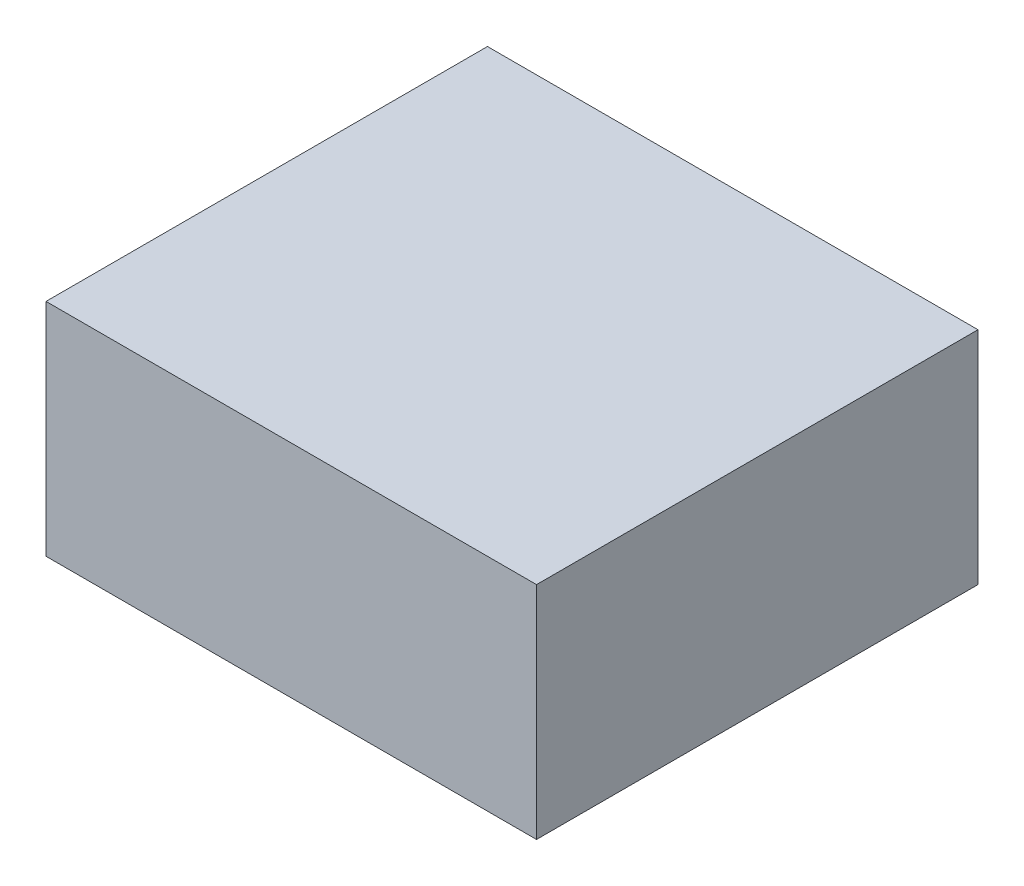
ISO-10303-21;
HEADER;
FILE_DESCRIPTION(('STEP AP214'),'2;1');
FILE_NAME('part.step','',(''),(''),'','','');
FILE_SCHEMA(('AUTOMOTIVE_DESIGN { 1 0 10303 214 1 1 1 1 }'));
ENDSEC;
DATA;
#1=APPLICATION_CONTEXT('core data for automotive mechanical design processes');
#2=APPLICATION_PROTOCOL_DEFINITION('international standard','automotive_design',2000,#1);
#3=PRODUCT_CONTEXT('',#1,'mechanical');
#4=PRODUCT('Part','Part','',(#3));
#5=PRODUCT_RELATED_PRODUCT_CATEGORY('part','',(#4));
#6=PRODUCT_DEFINITION_FORMATION('','',#4);
#7=PRODUCT_DEFINITION_CONTEXT('part definition',#1,'design');
#8=PRODUCT_DEFINITION('design','',#6,#7);
#9=PRODUCT_DEFINITION_SHAPE('','',#8);
#10=(LENGTH_UNIT() NAMED_UNIT(*) SI_UNIT(.MILLI.,.METRE.));
#11=(NAMED_UNIT(*) PLANE_ANGLE_UNIT() SI_UNIT($,.RADIAN.));
#12=(NAMED_UNIT(*) SI_UNIT($,.STERADIAN.) SOLID_ANGLE_UNIT());
#13=UNCERTAINTY_MEASURE_WITH_UNIT(LENGTH_MEASURE(1.E-05),#10,'distance_accuracy_value','');
#14=(GEOMETRIC_REPRESENTATION_CONTEXT(3) GLOBAL_UNCERTAINTY_ASSIGNED_CONTEXT((#13)) GLOBAL_UNIT_ASSIGNED_CONTEXT((#10,
#11,#12)) REPRESENTATION_CONTEXT('',''));
#15=CARTESIAN_POINT('',(0.,0.,0.));
#16=DIRECTION('',(0.,0.,1.));
#17=DIRECTION('',(1.,0.,0.));
#18=AXIS2_PLACEMENT_3D('',#15,#16,#17);
#19=CARTESIAN_POINT('',(-91.3822259136213,41.895,90.));
#20=DIRECTION('',(1.,0.,0.));
#21=DIRECTION('',(0.,0.,-1.));
#22=AXIS2_PLACEMENT_3D('',#19,#20,#21);
#23=PLANE('',#22);
#24=DIRECTION('',(0.,-1.,0.));
#25=VECTOR('',#24,1.);
#26=CARTESIAN_POINT('',(-91.3822259136213,41.895,0.));
#27=LINE('',#26,#25);
#28=CARTESIAN_POINT('',(-91.3822259136213,41.895,0.));
#29=VERTEX_POINT('',#28);
#30=CARTESIAN_POINT('',(-91.3822259136213,-3.105,0.));
#31=VERTEX_POINT('',#30);
#32=EDGE_CURVE('E107',#29,#31,#27,.T.);
#33=ORIENTED_EDGE('',*,*,#32,.T.);
#34=DIRECTION('',(0.,0.,-1.));
#35=VECTOR('',#34,1.);
#36=CARTESIAN_POINT('',(-91.3822259136213,-3.105,90.));
#37=LINE('',#36,#35);
#38=CARTESIAN_POINT('',(-91.3822259136213,-3.105,90.));
#39=VERTEX_POINT('',#38);
#40=EDGE_CURVE('E11',#39,#31,#37,.T.);
#41=ORIENTED_EDGE('',*,*,#40,.F.);
#42=DIRECTION('',(0.,-1.,0.));
#43=VECTOR('',#42,1.);
#44=CARTESIAN_POINT('',(-91.3822259136213,41.895,90.));
#45=LINE('',#44,#43);
#46=CARTESIAN_POINT('',(-91.3822259136213,41.895,90.));
#47=VERTEX_POINT('',#46);
#48=EDGE_CURVE('E91',#47,#39,#45,.T.);
#49=ORIENTED_EDGE('',*,*,#48,.F.);
#50=DIRECTION('',(0.,0.,-1.));
#51=VECTOR('',#50,1.);
#52=CARTESIAN_POINT('',(-91.3822259136213,41.895,90.));
#53=LINE('',#52,#51);
#54=EDGE_CURVE('E103',#47,#29,#53,.T.);
#55=ORIENTED_EDGE('',*,*,#54,.T.);
#56=EDGE_LOOP('',(#33,#41,#49,#55));
#57=FACE_BOUND('',#56,.T.);
#58=ADVANCED_FACE('F39',(#57),#23,.F.);
#59=CARTESIAN_POINT('',(-91.3822259136213,-3.105,90.));
#60=DIRECTION('',(0.,1.,0.));
#61=DIRECTION('',(0.,0.,1.));
#62=AXIS2_PLACEMENT_3D('',#59,#60,#61);
#63=PLANE('',#62);
#64=DIRECTION('',(1.,0.,0.));
#65=VECTOR('',#64,1.);
#66=CARTESIAN_POINT('',(-91.3822259136213,-3.105,0.));
#67=LINE('',#66,#65);
#68=CARTESIAN_POINT('',(8.61777408637875,-3.105,0.));
#69=VERTEX_POINT('',#68);
#70=EDGE_CURVE('E96',#31,#69,#67,.T.);
#71=ORIENTED_EDGE('',*,*,#70,.T.);
#72=DIRECTION('',(0.,0.,-1.));
#73=VECTOR('',#72,1.);
#74=CARTESIAN_POINT('',(8.61777408637875,-3.105,90.));
#75=LINE('',#74,#73);
#76=CARTESIAN_POINT('',(8.61777408637875,-3.105,90.));
#77=VERTEX_POINT('',#76);
#78=EDGE_CURVE('E48',#77,#69,#75,.T.);
#79=ORIENTED_EDGE('',*,*,#78,.F.);
#80=DIRECTION('',(1.,0.,0.));
#81=VECTOR('',#80,1.);
#82=CARTESIAN_POINT('',(-91.3822259136213,-3.105,90.));
#83=LINE('',#82,#81);
#84=EDGE_CURVE('E86',#39,#77,#83,.T.);
#85=ORIENTED_EDGE('',*,*,#84,.F.);
#86=ORIENTED_EDGE('',*,*,#40,.T.);
#87=EDGE_LOOP('',(#71,#79,#85,#86));
#88=FACE_BOUND('',#87,.T.);
#89=ADVANCED_FACE('F95',(#88),#63,.F.);
#90=CARTESIAN_POINT('',(8.61777408637874,41.895,90.));
#91=DIRECTION('',(-1.,0.,0.));
#92=DIRECTION('',(0.,-1.,0.));
#93=AXIS2_PLACEMENT_3D('',#90,#91,#92);
#94=PLANE('',#93);
#95=DIRECTION('',(0.,1.,0.));
#96=VECTOR('',#95,1.);
#97=CARTESIAN_POINT('',(8.61777408637874,41.895,0.));
#98=LINE('',#97,#96);
#99=CARTESIAN_POINT('',(8.61777408637874,41.895,0.));
#100=VERTEX_POINT('',#99);
#101=EDGE_CURVE('E73',#69,#100,#98,.T.);
#102=ORIENTED_EDGE('',*,*,#101,.T.);
#103=DIRECTION('',(0.,0.,-1.));
#104=VECTOR('',#103,1.);
#105=CARTESIAN_POINT('',(8.61777408637874,41.895,90.));
#106=LINE('',#105,#104);
#107=CARTESIAN_POINT('',(8.61777408637874,41.895,90.));
#108=VERTEX_POINT('',#107);
#109=EDGE_CURVE('E98',#108,#100,#106,.T.);
#110=ORIENTED_EDGE('',*,*,#109,.F.);
#111=DIRECTION('',(0.,1.,0.));
#112=VECTOR('',#111,1.);
#113=CARTESIAN_POINT('',(8.61777408637874,41.895,90.));
#114=LINE('',#113,#112);
#115=EDGE_CURVE('E89',#77,#108,#114,.T.);
#116=ORIENTED_EDGE('',*,*,#115,.F.);
#117=ORIENTED_EDGE('',*,*,#78,.T.);
#118=EDGE_LOOP('',(#102,#110,#116,#117));
#119=FACE_BOUND('',#118,.T.);
#120=ADVANCED_FACE('F99',(#119),#94,.F.);
#121=CARTESIAN_POINT('',(-91.3822259136213,41.895,90.));
#122=DIRECTION('',(0.,-1.,0.));
#123=DIRECTION('',(0.,0.,-1.));
#124=AXIS2_PLACEMENT_3D('',#121,#122,#123);
#125=PLANE('',#124);
#126=DIRECTION('',(-1.,0.,0.));
#127=VECTOR('',#126,1.);
#128=CARTESIAN_POINT('',(-91.3822259136213,41.895,0.));
#129=LINE('',#128,#127);
#130=EDGE_CURVE('E79',#100,#29,#129,.T.);
#131=ORIENTED_EDGE('',*,*,#130,.T.);
#132=ORIENTED_EDGE('',*,*,#54,.F.);
#133=DIRECTION('',(-1.,0.,0.));
#134=VECTOR('',#133,1.);
#135=CARTESIAN_POINT('',(-91.3822259136213,41.895,90.));
#136=LINE('',#135,#134);
#137=EDGE_CURVE('E56',#108,#47,#136,.T.);
#138=ORIENTED_EDGE('',*,*,#137,.F.);
#139=ORIENTED_EDGE('',*,*,#109,.T.);
#140=EDGE_LOOP('',(#131,#132,#138,#139));
#141=FACE_BOUND('',#140,.T.);
#142=ADVANCED_FACE('F120',(#141),#125,.F.);
#143=CARTESIAN_POINT('',(0.,0.,90.));
#144=DIRECTION('',(0.,0.,1.));
#145=DIRECTION('',(1.,0.,0.));
#146=AXIS2_PLACEMENT_3D('',#143,#144,#145);
#147=PLANE('',#146);
#148=ORIENTED_EDGE('',*,*,#48,.T.);
#149=ORIENTED_EDGE('',*,*,#84,.T.);
#150=ORIENTED_EDGE('',*,*,#115,.T.);
#151=ORIENTED_EDGE('',*,*,#137,.T.);
#152=EDGE_LOOP('',(#148,#149,#150,#151));
#153=FACE_BOUND('',#152,.T.);
#154=ADVANCED_FACE('F87',(#153),#147,.T.);
#155=CARTESIAN_POINT('',(0.,0.,0.));
#156=DIRECTION('',(0.,0.,1.));
#157=DIRECTION('',(1.,0.,0.));
#158=AXIS2_PLACEMENT_3D('',#155,#156,#157);
#159=PLANE('',#158);
#160=ORIENTED_EDGE('',*,*,#32,.F.);
#161=ORIENTED_EDGE('',*,*,#130,.F.);
#162=ORIENTED_EDGE('',*,*,#101,.F.);
#163=ORIENTED_EDGE('',*,*,#70,.F.);
#164=EDGE_LOOP('',(#160,#161,#162,#163));
#165=FACE_BOUND('',#164,.T.);
#166=ADVANCED_FACE('F123',(#165),#159,.F.);
#167=CLOSED_SHELL('',(#58,#89,#120,#142,#154,#166));
#168=MANIFOLD_SOLID_BREP('B2',#167);
#169=ADVANCED_BREP_SHAPE_REPRESENTATION('',(#18,#168),#14);
#170=SHAPE_DEFINITION_REPRESENTATION(#9,#169);
ENDSEC;
END-ISO-10303-21;
